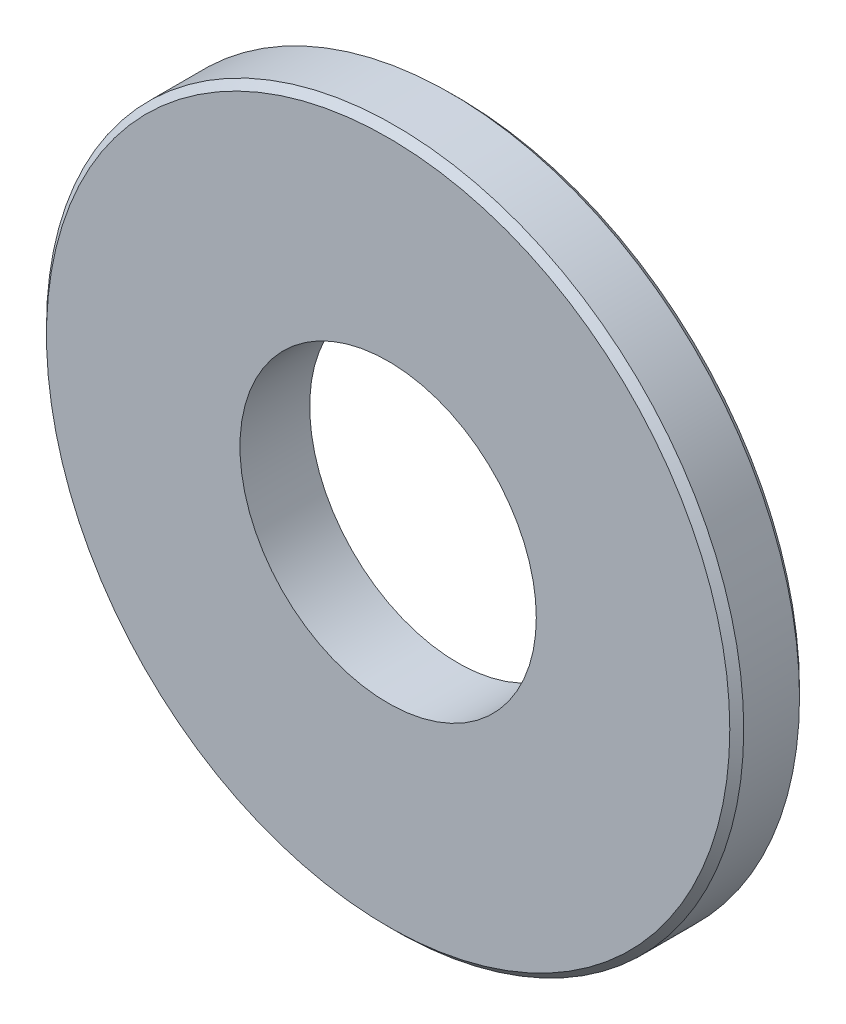
ISO-10303-21;
HEADER;
FILE_DESCRIPTION(('STEP AP214'),'2;1');
FILE_NAME('part.step','',(''),(''),'','','');
FILE_SCHEMA(('AUTOMOTIVE_DESIGN { 1 0 10303 214 1 1 1 1 }'));
ENDSEC;
DATA;
#1=APPLICATION_CONTEXT('core data for automotive mechanical design processes');
#2=APPLICATION_PROTOCOL_DEFINITION('international standard','automotive_design',2000,#1);
#3=PRODUCT_CONTEXT('',#1,'mechanical');
#4=PRODUCT('Part','Part','',(#3));
#5=PRODUCT_RELATED_PRODUCT_CATEGORY('part','',(#4));
#6=PRODUCT_DEFINITION_FORMATION('','',#4);
#7=PRODUCT_DEFINITION_CONTEXT('part definition',#1,'design');
#8=PRODUCT_DEFINITION('design','',#6,#7);
#9=PRODUCT_DEFINITION_SHAPE('','',#8);
#10=(LENGTH_UNIT() NAMED_UNIT(*) SI_UNIT(.MILLI.,.METRE.));
#11=(NAMED_UNIT(*) PLANE_ANGLE_UNIT() SI_UNIT($,.RADIAN.));
#12=(NAMED_UNIT(*) SI_UNIT($,.STERADIAN.) SOLID_ANGLE_UNIT());
#13=UNCERTAINTY_MEASURE_WITH_UNIT(LENGTH_MEASURE(1.E-05),#10,'distance_accuracy_value','');
#14=(GEOMETRIC_REPRESENTATION_CONTEXT(3) GLOBAL_UNCERTAINTY_ASSIGNED_CONTEXT((#13)) GLOBAL_UNIT_ASSIGNED_CONTEXT((#10,
#11,#12)) REPRESENTATION_CONTEXT('',''));
#15=CARTESIAN_POINT('',(0.,0.,0.));
#16=DIRECTION('',(0.,0.,1.));
#17=DIRECTION('',(1.,0.,0.));
#18=AXIS2_PLACEMENT_3D('',#15,#16,#17);
#19=CARTESIAN_POINT('',(0.,0.,2.));
#20=DIRECTION('',(0.,0.,1.));
#21=DIRECTION('',(1.,0.,0.));
#22=AXIS2_PLACEMENT_3D('',#19,#20,#21);
#23=PLANE('',#22);
#24=CARTESIAN_POINT('',(0.,0.,2.));
#25=DIRECTION('',(0.,0.,1.));
#26=DIRECTION('',(1.,0.,0.));
#27=AXIS2_PLACEMENT_3D('',#24,#25,#26);
#28=CIRCLE('',#27,9.79999999999999);
#29=CARTESIAN_POINT('',(9.79999999999999,0.,2.));
#30=VERTEX_POINT('',#29);
#31=EDGE_CURVE('E10',#30,#30,#28,.T.);
#32=ORIENTED_EDGE('',*,*,#31,.T.);
#33=EDGE_LOOP('',(#32));
#34=FACE_BOUND('',#33,.T.);
#35=CARTESIAN_POINT('',(0.,0.,2.));
#36=DIRECTION('',(0.,0.,1.));
#37=DIRECTION('',(1.,0.,0.));
#38=AXIS2_PLACEMENT_3D('',#35,#36,#37);
#39=CIRCLE('',#38,4.25);
#40=CARTESIAN_POINT('',(4.25,0.,2.));
#41=VERTEX_POINT('',#40);
#42=EDGE_CURVE('E57',#41,#41,#39,.T.);
#43=ORIENTED_EDGE('',*,*,#42,.F.);
#44=EDGE_LOOP('',(#43));
#45=FACE_BOUND('',#44,.T.);
#46=ADVANCED_FACE('F37',(#34,#45),#23,.T.);
#47=CARTESIAN_POINT('',(0.,0.,0.));
#48=DIRECTION('',(0.,0.,1.));
#49=DIRECTION('',(1.,0.,0.));
#50=AXIS2_PLACEMENT_3D('',#47,#48,#49);
#51=PLANE('',#50);
#52=CARTESIAN_POINT('',(0.,0.,0.));
#53=DIRECTION('',(0.,0.,1.));
#54=DIRECTION('',(1.,0.,0.));
#55=AXIS2_PLACEMENT_3D('',#52,#53,#54);
#56=CIRCLE('',#55,9.8);
#57=CARTESIAN_POINT('',(9.8,0.,0.));
#58=VERTEX_POINT('',#57);
#59=EDGE_CURVE('E44',#58,#58,#56,.F.);
#60=ORIENTED_EDGE('',*,*,#59,.T.);
#61=EDGE_LOOP('',(#60));
#62=FACE_BOUND('',#61,.T.);
#63=CARTESIAN_POINT('',(0.,0.,0.));
#64=DIRECTION('',(0.,0.,1.));
#65=DIRECTION('',(1.,0.,0.));
#66=AXIS2_PLACEMENT_3D('',#63,#64,#65);
#67=CIRCLE('',#66,4.25);
#68=CARTESIAN_POINT('',(4.25,0.,0.));
#69=VERTEX_POINT('',#68);
#70=EDGE_CURVE('E58',#69,#69,#67,.T.);
#71=ORIENTED_EDGE('',*,*,#70,.T.);
#72=EDGE_LOOP('',(#71));
#73=FACE_BOUND('',#72,.T.);
#74=ADVANCED_FACE('F68',(#62,#73),#51,.F.);
#75=CARTESIAN_POINT('',(0.,0.,2.));
#76=DIRECTION('',(0.,0.,-1.));
#77=DIRECTION('',(-1.,0.,0.));
#78=AXIS2_PLACEMENT_3D('',#75,#76,#77);
#79=CYLINDRICAL_SURFACE('',#78,10.);
#80=CARTESIAN_POINT('',(0.,0.,0.200000000000001));
#81=DIRECTION('',(0.,0.,1.));
#82=DIRECTION('',(1.,0.,0.));
#83=AXIS2_PLACEMENT_3D('',#80,#81,#82);
#84=CIRCLE('',#83,10.);
#85=CARTESIAN_POINT('',(10.,0.,0.200000000000001));
#86=VERTEX_POINT('',#85);
#87=EDGE_CURVE('E48',#86,#86,#84,.T.);
#88=ORIENTED_EDGE('',*,*,#87,.T.);
#89=EDGE_LOOP('',(#88));
#90=FACE_BOUND('',#89,.T.);
#91=CARTESIAN_POINT('',(0.,0.,1.79999999999999));
#92=DIRECTION('',(0.,0.,1.));
#93=DIRECTION('',(1.,0.,0.));
#94=AXIS2_PLACEMENT_3D('',#91,#92,#93);
#95=CIRCLE('',#94,10.);
#96=CARTESIAN_POINT('',(10.,0.,1.79999999999999));
#97=VERTEX_POINT('',#96);
#98=EDGE_CURVE('E52',#97,#97,#95,.F.);
#99=ORIENTED_EDGE('',*,*,#98,.T.);
#100=EDGE_LOOP('',(#99));
#101=FACE_BOUND('',#100,.T.);
#102=ADVANCED_FACE('F73',(#90,#101),#79,.T.);
#103=CARTESIAN_POINT('',(0.,0.,2.));
#104=DIRECTION('',(0.,0.,-1.));
#105=DIRECTION('',(-1.,0.,0.));
#106=AXIS2_PLACEMENT_3D('',#103,#104,#105);
#107=CYLINDRICAL_SURFACE('',#106,4.25);
#108=ORIENTED_EDGE('',*,*,#42,.T.);
#109=EDGE_LOOP('',(#108));
#110=FACE_BOUND('',#109,.T.);
#111=ORIENTED_EDGE('',*,*,#70,.F.);
#112=EDGE_LOOP('',(#111));
#113=FACE_BOUND('',#112,.T.);
#114=ADVANCED_FACE('F64',(#110,#113),#107,.F.);
#115=CARTESIAN_POINT('',(0.,0.,0.200000000000001));
#116=DIRECTION('',(0.,0.,1.));
#117=DIRECTION('',(1.,0.,0.));
#118=AXIS2_PLACEMENT_3D('',#115,#116,#117);
#119=CONICAL_SURFACE('',#118,10.,0.785398163397448);
#120=ORIENTED_EDGE('',*,*,#59,.F.);
#121=EDGE_LOOP('',(#120));
#122=FACE_BOUND('',#121,.T.);
#123=ORIENTED_EDGE('',*,*,#87,.F.);
#124=EDGE_LOOP('',(#123));
#125=FACE_BOUND('',#124,.T.);
#126=ADVANCED_FACE('F79',(#122,#125),#119,.T.);
#127=CARTESIAN_POINT('',(0.,0.,2.));
#128=DIRECTION('',(0.,0.,-1.));
#129=DIRECTION('',(-1.,0.,0.));
#130=AXIS2_PLACEMENT_3D('',#127,#128,#129);
#131=CONICAL_SURFACE('',#130,9.79999999999999,0.785398163397448);
#132=ORIENTED_EDGE('',*,*,#98,.F.);
#133=EDGE_LOOP('',(#132));
#134=FACE_BOUND('',#133,.T.);
#135=ORIENTED_EDGE('',*,*,#31,.F.);
#136=EDGE_LOOP('',(#135));
#137=FACE_BOUND('',#136,.T.);
#138=ADVANCED_FACE('F39',(#134,#137),#131,.T.);
#139=CLOSED_SHELL('',(#46,#74,#102,#114,#126,#138));
#140=MANIFOLD_SOLID_BREP('B2',#139);
#141=ADVANCED_BREP_SHAPE_REPRESENTATION('',(#18,#140),#14);
#142=SHAPE_DEFINITION_REPRESENTATION(#9,#141);
ENDSEC;
END-ISO-10303-21;
